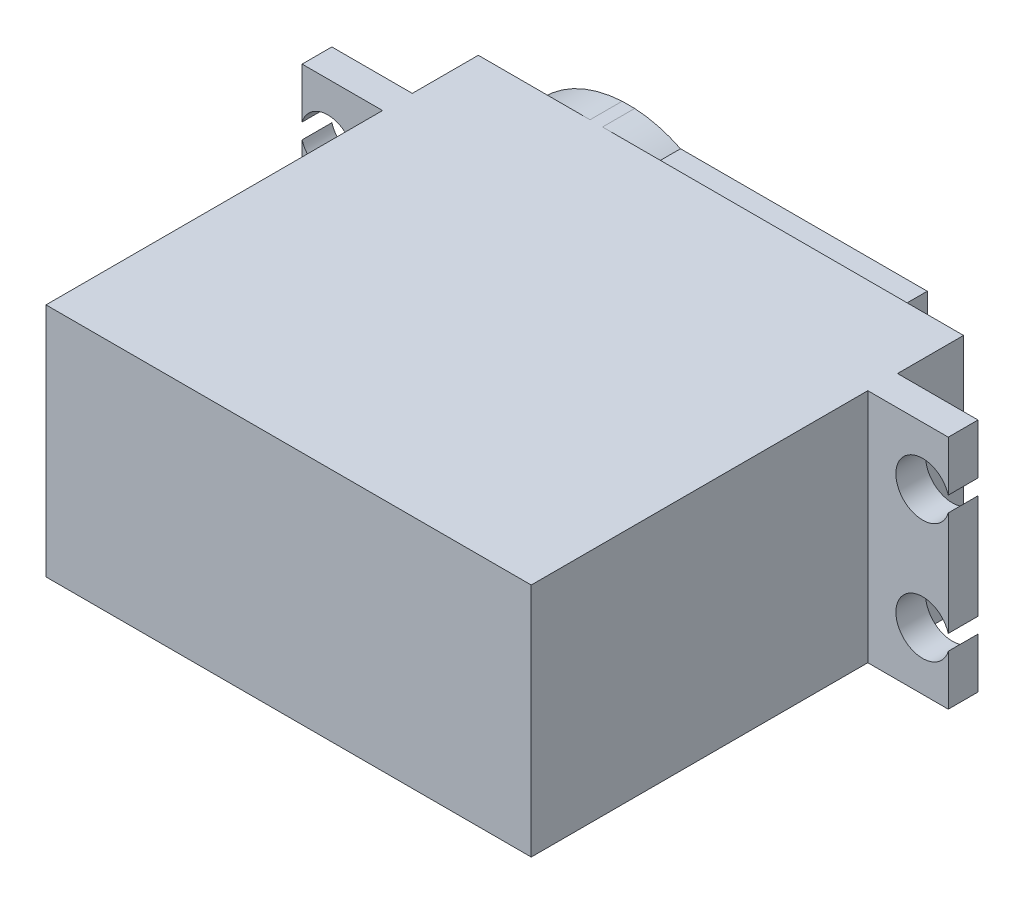
ISO-10303-21;
HEADER;
FILE_DESCRIPTION(('STEP AP214'),'2;1');
FILE_NAME('part.step','',(''),(''),'','','');
FILE_SCHEMA(('AUTOMOTIVE_DESIGN { 1 0 10303 214 1 1 1 1 }'));
ENDSEC;
DATA;
#1=APPLICATION_CONTEXT('core data for automotive mechanical design processes');
#2=APPLICATION_PROTOCOL_DEFINITION('international standard','automotive_design',2000,#1);
#3=PRODUCT_CONTEXT('',#1,'mechanical');
#4=PRODUCT('Part','Part','',(#3));
#5=PRODUCT_RELATED_PRODUCT_CATEGORY('part','',(#4));
#6=PRODUCT_DEFINITION_FORMATION('','',#4);
#7=PRODUCT_DEFINITION_CONTEXT('part definition',#1,'design');
#8=PRODUCT_DEFINITION('design','',#6,#7);
#9=PRODUCT_DEFINITION_SHAPE('','',#8);
#10=(LENGTH_UNIT() NAMED_UNIT(*) SI_UNIT(.MILLI.,.METRE.));
#11=(NAMED_UNIT(*) PLANE_ANGLE_UNIT() SI_UNIT($,.RADIAN.));
#12=(NAMED_UNIT(*) SI_UNIT($,.STERADIAN.) SOLID_ANGLE_UNIT());
#13=UNCERTAINTY_MEASURE_WITH_UNIT(LENGTH_MEASURE(1.E-05),#10,'distance_accuracy_value','');
#14=(GEOMETRIC_REPRESENTATION_CONTEXT(3) GLOBAL_UNCERTAINTY_ASSIGNED_CONTEXT((#13)) GLOBAL_UNIT_ASSIGNED_CONTEXT((#10,
#11,#12)) REPRESENTATION_CONTEXT('',''));
#15=CARTESIAN_POINT('',(0.,0.,0.));
#16=DIRECTION('',(0.,0.,1.));
#17=DIRECTION('',(1.,0.,0.));
#18=AXIS2_PLACEMENT_3D('',#15,#16,#17);
#19=CARTESIAN_POINT('',(-20.399999967,19.812,-18.174999972));
#20=DIRECTION('',(0.,0.,1.));
#21=DIRECTION('',(1.,0.,0.));
#22=AXIS2_PLACEMENT_3D('',#19,#20,#21);
#23=PLANE('',#22);
#24=CARTESIAN_POINT('',(-10.4799999729716,9.906,-18.174999972));
#25=DIRECTION('',(0.,0.,-1.));
#26=DIRECTION('',(-1.,0.,0.));
#27=AXIS2_PLACEMENT_3D('',#24,#25,#26);
#28=CIRCLE('',#27,9.9199999940284);
#29=CARTESIAN_POINT('',(-11.0068432907838,0.,-18.174999972));
#30=VERTEX_POINT('',#29);
#31=CARTESIAN_POINT('',(-20.399999967,9.906,-18.174999972));
#32=VERTEX_POINT('',#31);
#33=EDGE_CURVE('E493',#30,#32,#28,.T.);
#34=ORIENTED_EDGE('',*,*,#33,.F.);
#35=DIRECTION('',(-1.,0.,0.));
#36=VECTOR('',#35,1.);
#37=CARTESIAN_POINT('',(-20.399999967,0.,-18.174999972));
#38=LINE('',#37,#36);
#39=CARTESIAN_POINT('',(-20.399999967,0.,-18.174999972));
#40=VERTEX_POINT('',#39);
#41=EDGE_CURVE('E371',#30,#40,#38,.T.);
#42=ORIENTED_EDGE('',*,*,#41,.T.);
#43=DIRECTION('',(0.,-1.,0.));
#44=VECTOR('',#43,1.);
#45=CARTESIAN_POINT('',(-20.399999967,19.812,-18.174999972));
#46=LINE('',#45,#44);
#47=EDGE_CURVE('E455',#32,#40,#46,.T.);
#48=ORIENTED_EDGE('',*,*,#47,.F.);
#49=EDGE_LOOP('',(#34,#42,#48));
#50=FACE_BOUND('',#49,.T.);
#51=ADVANCED_FACE('F51',(#50),#23,.F.);
#52=CARTESIAN_POINT('',(-11.0068432907839,19.812,-18.174999972));
#53=VERTEX_POINT('',#52);
#54=EDGE_CURVE('E475',#32,#53,#28,.T.);
#55=ORIENTED_EDGE('',*,*,#54,.F.);
#56=CARTESIAN_POINT('',(-20.399999967,19.812,-18.174999972));
#57=VERTEX_POINT('',#56);
#58=EDGE_CURVE('E456',#57,#32,#46,.T.);
#59=ORIENTED_EDGE('',*,*,#58,.F.);
#60=DIRECTION('',(-1.,0.,0.));
#61=VECTOR('',#60,1.);
#62=CARTESIAN_POINT('',(-20.399999967,19.812,-18.174999972));
#63=LINE('',#62,#61);
#64=EDGE_CURVE('E331',#53,#57,#63,.T.);
#65=ORIENTED_EDGE('',*,*,#64,.F.);
#66=EDGE_LOOP('',(#55,#59,#65));
#67=FACE_BOUND('',#66,.T.);
#68=ADVANCED_FACE('F569',(#67),#23,.F.);
#69=CARTESIAN_POINT('',(-27.164999899,19.812,-12.624999896));
#70=DIRECTION('',(1.,0.,0.));
#71=DIRECTION('',(0.,0.,-1.));
#72=AXIS2_PLACEMENT_3D('',#69,#70,#71);
#73=PLANE('',#72);
#74=DIRECTION('',(0.,-1.,0.));
#75=VECTOR('',#74,1.);
#76=CARTESIAN_POINT('',(-27.164999899,19.812,-10.124999816));
#77=LINE('',#76,#75);
#78=CARTESIAN_POINT('',(-27.164999899,14.2951038691055,-10.124999816));
#79=VERTEX_POINT('',#78);
#80=CARTESIAN_POINT('',(-27.164999899,5.5168961308945,-10.124999816));
#81=VERTEX_POINT('',#80);
#82=EDGE_CURVE('E445',#79,#81,#77,.T.);
#83=ORIENTED_EDGE('',*,*,#82,.F.);
#84=DIRECTION('',(0.,0.,-1.));
#85=VECTOR('',#84,1.);
#86=CARTESIAN_POINT('',(-27.164999899,14.2951038691055,18.174999972));
#87=LINE('',#86,#85);
#88=CARTESIAN_POINT('',(-27.164999899,14.2951038691055,-12.624999896));
#89=VERTEX_POINT('',#88);
#90=EDGE_CURVE('E322',#79,#89,#87,.T.);
#91=ORIENTED_EDGE('',*,*,#90,.T.);
#92=DIRECTION('',(0.,-1.,0.));
#93=VECTOR('',#92,1.);
#94=CARTESIAN_POINT('',(-27.164999899,19.812,-12.624999896));
#95=LINE('',#94,#93);
#96=CARTESIAN_POINT('',(-27.164999899,5.5168961308945,-12.624999896));
#97=VERTEX_POINT('',#96);
#98=EDGE_CURVE('E451',#89,#97,#95,.T.);
#99=ORIENTED_EDGE('',*,*,#98,.T.);
#100=DIRECTION('',(0.,0.,-1.));
#101=VECTOR('',#100,1.);
#102=CARTESIAN_POINT('',(-27.164999899,5.5168961308945,18.174999972));
#103=LINE('',#102,#101);
#104=EDGE_CURVE('E310',#97,#81,#103,.F.);
#105=ORIENTED_EDGE('',*,*,#104,.T.);
#106=EDGE_LOOP('',(#83,#91,#99,#105));
#107=FACE_BOUND('',#106,.T.);
#108=ADVANCED_FACE('F576',(#107),#73,.F.);
#109=CARTESIAN_POINT('',(-27.164999899,4.2231036931055,-10.124999816));
#110=VERTEX_POINT('',#109);
#111=CARTESIAN_POINT('',(-27.164999899,0.,-10.124999816));
#112=VERTEX_POINT('',#111);
#113=EDGE_CURVE('E439',#110,#112,#77,.T.);
#114=ORIENTED_EDGE('',*,*,#113,.F.);
#115=DIRECTION('',(0.,0.,-1.));
#116=VECTOR('',#115,1.);
#117=CARTESIAN_POINT('',(-27.164999899,4.2231036931055,18.174999972));
#118=LINE('',#117,#116);
#119=CARTESIAN_POINT('',(-27.164999899,4.2231036931055,-12.624999896));
#120=VERTEX_POINT('',#119);
#121=EDGE_CURVE('E314',#110,#120,#118,.T.);
#122=ORIENTED_EDGE('',*,*,#121,.T.);
#123=CARTESIAN_POINT('',(-27.164999899,0.,-12.624999896));
#124=VERTEX_POINT('',#123);
#125=EDGE_CURVE('E444',#120,#124,#95,.T.);
#126=ORIENTED_EDGE('',*,*,#125,.T.);
#127=DIRECTION('',(0.,0.,1.));
#128=VECTOR('',#127,1.);
#129=CARTESIAN_POINT('',(-27.164999899,0.,-12.624999896));
#130=LINE('',#129,#128);
#131=EDGE_CURVE('E382',#124,#112,#130,.T.);
#132=ORIENTED_EDGE('',*,*,#131,.T.);
#133=EDGE_LOOP('',(#114,#122,#126,#132));
#134=FACE_BOUND('',#133,.T.);
#135=ADVANCED_FACE('F710',(#134),#73,.F.);
#136=CARTESIAN_POINT('',(27.164999899,19.812,-12.624999896));
#137=DIRECTION('',(-1.,0.,0.));
#138=DIRECTION('',(0.,0.,1.));
#139=AXIS2_PLACEMENT_3D('',#136,#137,#138);
#140=PLANE('',#139);
#141=DIRECTION('',(0.,-1.,0.));
#142=VECTOR('',#141,1.);
#143=CARTESIAN_POINT('',(27.164999899,19.812,-10.124999816));
#144=LINE('',#143,#142);
#145=CARTESIAN_POINT('',(27.164999899,14.2951038691055,-10.124999816));
#146=VERTEX_POINT('',#145);
#147=CARTESIAN_POINT('',(27.164999899,5.5168961308945,-10.124999816));
#148=VERTEX_POINT('',#147);
#149=EDGE_CURVE('E423',#146,#148,#144,.T.);
#150=ORIENTED_EDGE('',*,*,#149,.T.);
#151=DIRECTION('',(0.,0.,-1.));
#152=VECTOR('',#151,1.);
#153=CARTESIAN_POINT('',(27.164999899,5.5168961308945,18.174999972));
#154=LINE('',#153,#152);
#155=CARTESIAN_POINT('',(27.164999899,5.5168961308945,-12.624999896));
#156=VERTEX_POINT('',#155);
#157=EDGE_CURVE('E306',#148,#156,#154,.T.);
#158=ORIENTED_EDGE('',*,*,#157,.T.);
#159=DIRECTION('',(0.,-1.,0.));
#160=VECTOR('',#159,1.);
#161=CARTESIAN_POINT('',(27.164999899,19.812,-12.624999896));
#162=LINE('',#161,#160);
#163=CARTESIAN_POINT('',(27.164999899,14.2951038691055,-12.624999896));
#164=VERTEX_POINT('',#163);
#165=EDGE_CURVE('E417',#164,#156,#162,.T.);
#166=ORIENTED_EDGE('',*,*,#165,.F.);
#167=DIRECTION('',(0.,0.,-1.));
#168=VECTOR('',#167,1.);
#169=CARTESIAN_POINT('',(27.164999899,14.2951038691055,18.174999972));
#170=LINE('',#169,#168);
#171=EDGE_CURVE('E286',#164,#146,#170,.F.);
#172=ORIENTED_EDGE('',*,*,#171,.T.);
#173=EDGE_LOOP('',(#150,#158,#166,#172));
#174=FACE_BOUND('',#173,.T.);
#175=ADVANCED_FACE('F687',(#174),#140,.F.);
#176=CARTESIAN_POINT('',(27.164999899,19.812,-10.124999816));
#177=VERTEX_POINT('',#176);
#178=CARTESIAN_POINT('',(27.164999899,15.5888963068945,-10.124999816));
#179=VERTEX_POINT('',#178);
#180=EDGE_CURVE('E418',#177,#179,#144,.T.);
#181=ORIENTED_EDGE('',*,*,#180,.T.);
#182=DIRECTION('',(0.,0.,-1.));
#183=VECTOR('',#182,1.);
#184=CARTESIAN_POINT('',(27.164999899,15.5888963068945,18.174999972));
#185=LINE('',#184,#183);
#186=CARTESIAN_POINT('',(27.164999899,15.5888963068945,-12.624999896));
#187=VERTEX_POINT('',#186);
#188=EDGE_CURVE('E294',#179,#187,#185,.T.);
#189=ORIENTED_EDGE('',*,*,#188,.T.);
#190=CARTESIAN_POINT('',(27.164999899,19.812,-12.624999896));
#191=VERTEX_POINT('',#190);
#192=EDGE_CURVE('E412',#191,#187,#162,.T.);
#193=ORIENTED_EDGE('',*,*,#192,.F.);
#194=DIRECTION('',(0.,0.,-1.));
#195=VECTOR('',#194,1.);
#196=CARTESIAN_POINT('',(27.164999899,19.812,-12.624999896));
#197=LINE('',#196,#195);
#198=EDGE_CURVE('E361',#177,#191,#197,.T.);
#199=ORIENTED_EDGE('',*,*,#198,.F.);
#200=EDGE_LOOP('',(#181,#189,#193,#199));
#201=FACE_BOUND('',#200,.T.);
#202=ADVANCED_FACE('F587',(#201),#140,.F.);
#203=CARTESIAN_POINT('',(20.399999967,19.812,-12.624999896));
#204=DIRECTION('',(-1.,0.,0.));
#205=DIRECTION('',(0.,0.,1.));
#206=AXIS2_PLACEMENT_3D('',#203,#204,#205);
#207=PLANE('',#206);
#208=DIRECTION('',(0.,0.,-1.));
#209=VECTOR('',#208,1.);
#210=CARTESIAN_POINT('',(20.399999967,0.,-12.624999896));
#211=LINE('',#210,#209);
#212=CARTESIAN_POINT('',(20.399999967,0.,-12.624999896));
#213=VERTEX_POINT('',#212);
#214=CARTESIAN_POINT('',(20.399999967,0.,-18.174999972));
#215=VERTEX_POINT('',#214);
#216=EDGE_CURVE('E326',#213,#215,#211,.T.);
#217=ORIENTED_EDGE('',*,*,#216,.T.);
#218=DIRECTION('',(0.,-1.,0.));
#219=VECTOR('',#218,1.);
#220=CARTESIAN_POINT('',(20.399999967,19.812,-18.174999972));
#221=LINE('',#220,#219);
#222=CARTESIAN_POINT('',(20.399999967,19.812,-18.174999972));
#223=VERTEX_POINT('',#222);
#224=EDGE_CURVE('E460',#223,#215,#221,.T.);
#225=ORIENTED_EDGE('',*,*,#224,.F.);
#226=DIRECTION('',(0.,0.,-1.));
#227=VECTOR('',#226,1.);
#228=CARTESIAN_POINT('',(20.399999967,19.812,-12.624999896));
#229=LINE('',#228,#227);
#230=CARTESIAN_POINT('',(20.399999967,19.812,-12.624999896));
#231=VERTEX_POINT('',#230);
#232=EDGE_CURVE('E327',#231,#223,#229,.T.);
#233=ORIENTED_EDGE('',*,*,#232,.F.);
#234=DIRECTION('',(0.,-1.,0.));
#235=VECTOR('',#234,1.);
#236=CARTESIAN_POINT('',(20.399999967,19.812,-12.624999896));
#237=LINE('',#236,#235);
#238=EDGE_CURVE('E367',#231,#213,#237,.T.);
#239=ORIENTED_EDGE('',*,*,#238,.T.);
#240=EDGE_LOOP('',(#217,#225,#233,#239));
#241=FACE_BOUND('',#240,.T.);
#242=ADVANCED_FACE('F53',(#241),#207,.F.);
#243=CARTESIAN_POINT('',(-9.95315665515932,19.812,-18.174999972));
#244=VERTEX_POINT('',#243);
#245=CARTESIAN_POINT('',(-6.098630297,18.80599998,-18.174999972));
#246=VERTEX_POINT('',#245);
#247=EDGE_CURVE('E480',#244,#246,#28,.T.);
#248=ORIENTED_EDGE('',*,*,#247,.F.);
#249=EDGE_CURVE('E333',#223,#244,#63,.T.);
#250=ORIENTED_EDGE('',*,*,#249,.F.);
#251=ORIENTED_EDGE('',*,*,#224,.T.);
#252=CARTESIAN_POINT('',(-9.95315665515939,0.,-18.174999972));
#253=VERTEX_POINT('',#252);
#254=EDGE_CURVE('E372',#215,#253,#38,.T.);
#255=ORIENTED_EDGE('',*,*,#254,.T.);
#256=CARTESIAN_POINT('',(-6.098630297,1.00600002,-18.174999972));
#257=VERTEX_POINT('',#256);
#258=EDGE_CURVE('E481',#257,#253,#28,.T.);
#259=ORIENTED_EDGE('',*,*,#258,.F.);
#260=DIRECTION('',(-1.,0.,0.));
#261=VECTOR('',#260,1.);
#262=CARTESIAN_POINT('',(0.,1.00600002,-18.174999972));
#263=LINE('',#262,#261);
#264=CARTESIAN_POINT('',(14.650000037,1.00600002,-18.174999972));
#265=VERTEX_POINT('',#264);
#266=EDGE_CURVE('E269',#265,#257,#263,.T.);
#267=ORIENTED_EDGE('',*,*,#266,.F.);
#268=DIRECTION('',(0.,1.,0.));
#269=VECTOR('',#268,1.);
#270=CARTESIAN_POINT('',(14.650000037,0.,-18.174999972));
#271=LINE('',#270,#269);
#272=CARTESIAN_POINT('',(14.650000037,18.80599998,-18.174999972));
#273=VERTEX_POINT('',#272);
#274=EDGE_CURVE('E74',#265,#273,#271,.T.);
#275=ORIENTED_EDGE('',*,*,#274,.T.);
#276=DIRECTION('',(-1.,0.,0.));
#277=VECTOR('',#276,1.);
#278=CARTESIAN_POINT('',(0.,18.80599998,-18.174999972));
#279=LINE('',#278,#277);
#280=EDGE_CURVE('E69',#273,#246,#279,.T.);
#281=ORIENTED_EDGE('',*,*,#280,.T.);
#282=EDGE_LOOP('',(#248,#250,#251,#255,#259,#267,#275,#281));
#283=FACE_BOUND('',#282,.T.);
#284=ADVANCED_FACE('F571',(#283),#23,.F.);
#285=CARTESIAN_POINT('',(-20.399999967,19.812,-12.624999896));
#286=DIRECTION('',(1.,0.,0.));
#287=DIRECTION('',(0.,0.,-1.));
#288=AXIS2_PLACEMENT_3D('',#285,#286,#287);
#289=PLANE('',#288);
#290=DIRECTION('',(0.,0.,1.));
#291=VECTOR('',#290,1.);
#292=CARTESIAN_POINT('',(-20.399999967,0.,-12.624999896));
#293=LINE('',#292,#291);
#294=CARTESIAN_POINT('',(-20.399999967,0.,-12.624999896));
#295=VERTEX_POINT('',#294);
#296=EDGE_CURVE('E375',#40,#295,#293,.T.);
#297=ORIENTED_EDGE('',*,*,#296,.T.);
#298=DIRECTION('',(0.,-1.,0.));
#299=VECTOR('',#298,1.);
#300=CARTESIAN_POINT('',(-20.399999967,19.812,-12.624999896));
#301=LINE('',#300,#299);
#302=CARTESIAN_POINT('',(-20.399999967,19.812,-12.624999896));
#303=VERTEX_POINT('',#302);
#304=EDGE_CURVE('E450',#303,#295,#301,.T.);
#305=ORIENTED_EDGE('',*,*,#304,.F.);
#306=DIRECTION('',(0.,0.,1.));
#307=VECTOR('',#306,1.);
#308=CARTESIAN_POINT('',(-20.399999967,19.812,-12.624999896));
#309=LINE('',#308,#307);
#310=EDGE_CURVE('E337',#57,#303,#309,.T.);
#311=ORIENTED_EDGE('',*,*,#310,.F.);
#312=ORIENTED_EDGE('',*,*,#58,.T.);
#313=ORIENTED_EDGE('',*,*,#47,.T.);
#314=EDGE_LOOP('',(#297,#305,#311,#312,#313));
#315=FACE_BOUND('',#314,.T.);
#316=ADVANCED_FACE('F580',(#315),#289,.F.);
#317=CARTESIAN_POINT('',(-20.399999967,19.812,-12.624999896));
#318=DIRECTION('',(0.,0.,1.));
#319=DIRECTION('',(1.,0.,0.));
#320=AXIS2_PLACEMENT_3D('',#317,#318,#319);
#321=PLANE('',#320);
#322=ORIENTED_EDGE('',*,*,#98,.F.);
#323=CARTESIAN_POINT('',(-25.009999891,14.942000088,-12.624999896));
#324=DIRECTION('',(0.,0.,-1.));
#325=DIRECTION('',(1.,0.,0.));
#326=AXIS2_PLACEMENT_3D('',#323,#324,#325);
#327=CIRCLE('',#326,2.249999945);
#328=CARTESIAN_POINT('',(-27.164999899,15.5888963068945,-12.624999896));
#329=VERTEX_POINT('',#328);
#330=EDGE_CURVE('E275',#329,#89,#327,.T.);
#331=ORIENTED_EDGE('',*,*,#330,.F.);
#332=CARTESIAN_POINT('',(-27.164999899,19.812,-12.624999896));
#333=VERTEX_POINT('',#332);
#334=EDGE_CURVE('E446',#333,#329,#95,.T.);
#335=ORIENTED_EDGE('',*,*,#334,.F.);
#336=DIRECTION('',(-1.,0.,0.));
#337=VECTOR('',#336,1.);
#338=CARTESIAN_POINT('',(-20.399999967,19.812,-12.624999896));
#339=LINE('',#338,#337);
#340=EDGE_CURVE('E340',#303,#333,#339,.T.);
#341=ORIENTED_EDGE('',*,*,#340,.F.);
#342=ORIENTED_EDGE('',*,*,#304,.T.);
#343=DIRECTION('',(-1.,0.,0.));
#344=VECTOR('',#343,1.);
#345=CARTESIAN_POINT('',(-20.399999967,0.,-12.624999896));
#346=LINE('',#345,#344);
#347=EDGE_CURVE('E378',#295,#124,#346,.T.);
#348=ORIENTED_EDGE('',*,*,#347,.T.);
#349=ORIENTED_EDGE('',*,*,#125,.F.);
#350=CARTESIAN_POINT('',(-25.009999891,4.869999912,-12.624999896));
#351=DIRECTION('',(0.,0.,-1.));
#352=DIRECTION('',(-1.,0.,0.));
#353=AXIS2_PLACEMENT_3D('',#350,#351,#352);
#354=CIRCLE('',#353,2.249999945);
#355=EDGE_CURVE('E282',#97,#120,#354,.T.);
#356=ORIENTED_EDGE('',*,*,#355,.F.);
#357=EDGE_LOOP('',(#322,#331,#335,#341,#342,#348,#349,#356));
#358=FACE_BOUND('',#357,.T.);
#359=ADVANCED_FACE('F584',(#358),#321,.F.);
#360=ORIENTED_EDGE('',*,*,#334,.T.);
#361=DIRECTION('',(0.,0.,-1.));
#362=VECTOR('',#361,1.);
#363=CARTESIAN_POINT('',(-27.164999899,15.5888963068945,18.174999972));
#364=LINE('',#363,#362);
#365=CARTESIAN_POINT('',(-27.164999899,15.5888963068945,-10.124999816));
#366=VERTEX_POINT('',#365);
#367=EDGE_CURVE('E318',#329,#366,#364,.F.);
#368=ORIENTED_EDGE('',*,*,#367,.T.);
#369=CARTESIAN_POINT('',(-27.164999899,19.812,-10.124999816));
#370=VERTEX_POINT('',#369);
#371=EDGE_CURVE('E440',#370,#366,#77,.T.);
#372=ORIENTED_EDGE('',*,*,#371,.F.);
#373=DIRECTION('',(0.,0.,1.));
#374=VECTOR('',#373,1.);
#375=CARTESIAN_POINT('',(-27.164999899,19.812,-12.624999896));
#376=LINE('',#375,#374);
#377=EDGE_CURVE('E343',#333,#370,#376,.T.);
#378=ORIENTED_EDGE('',*,*,#377,.F.);
#379=EDGE_LOOP('',(#360,#368,#372,#378));
#380=FACE_BOUND('',#379,.T.);
#381=ADVANCED_FACE('F706',(#380),#73,.F.);
#382=CARTESIAN_POINT('',(-27.164999899,19.812,-10.124999816));
#383=DIRECTION('',(0.,0.,-1.));
#384=DIRECTION('',(-1.,0.,0.));
#385=AXIS2_PLACEMENT_3D('',#382,#383,#384);
#386=PLANE('',#385);
#387=ORIENTED_EDGE('',*,*,#371,.T.);
#388=CARTESIAN_POINT('',(-25.009999891,14.942000088,-10.124999816));
#389=DIRECTION('',(0.,0.,-1.));
#390=DIRECTION('',(-1.,0.,0.));
#391=AXIS2_PLACEMENT_3D('',#388,#389,#390);
#392=CIRCLE('',#391,2.249999945);
#393=EDGE_CURVE('E55',#366,#79,#392,.T.);
#394=ORIENTED_EDGE('',*,*,#393,.T.);
#395=ORIENTED_EDGE('',*,*,#82,.T.);
#396=CARTESIAN_POINT('',(-25.009999891,4.869999912,-10.124999816));
#397=DIRECTION('',(0.,0.,-1.));
#398=DIRECTION('',(-1.,0.,0.));
#399=AXIS2_PLACEMENT_3D('',#396,#397,#398);
#400=CIRCLE('',#399,2.249999945);
#401=EDGE_CURVE('E467',#81,#110,#400,.T.);
#402=ORIENTED_EDGE('',*,*,#401,.T.);
#403=ORIENTED_EDGE('',*,*,#113,.T.);
#404=DIRECTION('',(1.,0.,0.));
#405=VECTOR('',#404,1.);
#406=CARTESIAN_POINT('',(-27.164999899,0.,-10.124999816));
#407=LINE('',#406,#405);
#408=CARTESIAN_POINT('',(-20.399999967,0.,-10.124999816));
#409=VERTEX_POINT('',#408);
#410=EDGE_CURVE('E386',#112,#409,#407,.T.);
#411=ORIENTED_EDGE('',*,*,#410,.T.);
#412=DIRECTION('',(0.,-1.,0.));
#413=VECTOR('',#412,1.);
#414=CARTESIAN_POINT('',(-20.399999967,19.812,-10.124999816));
#415=LINE('',#414,#413);
#416=CARTESIAN_POINT('',(-20.399999967,19.812,-10.124999816));
#417=VERTEX_POINT('',#416);
#418=EDGE_CURVE('E435',#417,#409,#415,.T.);
#419=ORIENTED_EDGE('',*,*,#418,.F.);
#420=DIRECTION('',(1.,0.,0.));
#421=VECTOR('',#420,1.);
#422=CARTESIAN_POINT('',(-27.164999899,19.812,-10.124999816));
#423=LINE('',#422,#421);
#424=EDGE_CURVE('E346',#370,#417,#423,.T.);
#425=ORIENTED_EDGE('',*,*,#424,.F.);
#426=EDGE_LOOP('',(#387,#394,#395,#402,#403,#411,#419,#425));
#427=FACE_BOUND('',#426,.T.);
#428=ADVANCED_FACE('F702',(#427),#386,.F.);
#429=CARTESIAN_POINT('',(-20.399999967,19.812,18.174999972));
#430=DIRECTION('',(1.,0.,0.));
#431=DIRECTION('',(0.,0.,-1.));
#432=AXIS2_PLACEMENT_3D('',#429,#430,#431);
#433=PLANE('',#432);
#434=DIRECTION('',(0.,0.,1.));
#435=VECTOR('',#434,1.);
#436=CARTESIAN_POINT('',(-20.399999967,0.,18.174999972));
#437=LINE('',#436,#435);
#438=CARTESIAN_POINT('',(-20.399999967,0.,18.174999972));
#439=VERTEX_POINT('',#438);
#440=EDGE_CURVE('E389',#409,#439,#437,.T.);
#441=ORIENTED_EDGE('',*,*,#440,.T.);
#442=DIRECTION('',(0.,-1.,0.));
#443=VECTOR('',#442,1.);
#444=CARTESIAN_POINT('',(-20.399999967,19.812,18.174999972));
#445=LINE('',#444,#443);
#446=CARTESIAN_POINT('',(-20.399999967,19.812,18.174999972));
#447=VERTEX_POINT('',#446);
#448=EDGE_CURVE('E431',#447,#439,#445,.T.);
#449=ORIENTED_EDGE('',*,*,#448,.F.);
#450=DIRECTION('',(0.,0.,1.));
#451=VECTOR('',#450,1.);
#452=CARTESIAN_POINT('',(-20.399999967,19.812,18.174999972));
#453=LINE('',#452,#451);
#454=EDGE_CURVE('E349',#417,#447,#453,.T.);
#455=ORIENTED_EDGE('',*,*,#454,.F.);
#456=ORIENTED_EDGE('',*,*,#418,.T.);
#457=EDGE_LOOP('',(#441,#449,#455,#456));
#458=FACE_BOUND('',#457,.T.);
#459=ADVANCED_FACE('F698',(#458),#433,.F.);
#460=CARTESIAN_POINT('',(-20.399999967,19.812,18.174999972));
#461=DIRECTION('',(0.,0.,-1.));
#462=DIRECTION('',(-1.,0.,0.));
#463=AXIS2_PLACEMENT_3D('',#460,#461,#462);
#464=PLANE('',#463);
#465=DIRECTION('',(1.,0.,0.));
#466=VECTOR('',#465,1.);
#467=CARTESIAN_POINT('',(-20.399999967,0.,18.174999972));
#468=LINE('',#467,#466);
#469=CARTESIAN_POINT('',(20.399999967,0.,18.174999972));
#470=VERTEX_POINT('',#469);
#471=EDGE_CURVE('E392',#439,#470,#468,.T.);
#472=ORIENTED_EDGE('',*,*,#471,.T.);
#473=DIRECTION('',(0.,-1.,0.));
#474=VECTOR('',#473,1.);
#475=CARTESIAN_POINT('',(20.399999967,19.812,18.174999972));
#476=LINE('',#475,#474);
#477=CARTESIAN_POINT('',(20.399999967,19.812,18.174999972));
#478=VERTEX_POINT('',#477);
#479=EDGE_CURVE('E427',#478,#470,#476,.T.);
#480=ORIENTED_EDGE('',*,*,#479,.F.);
#481=DIRECTION('',(1.,0.,0.));
#482=VECTOR('',#481,1.);
#483=CARTESIAN_POINT('',(-20.399999967,19.812,18.174999972));
#484=LINE('',#483,#482);
#485=EDGE_CURVE('E352',#447,#478,#484,.T.);
#486=ORIENTED_EDGE('',*,*,#485,.F.);
#487=ORIENTED_EDGE('',*,*,#448,.T.);
#488=EDGE_LOOP('',(#472,#480,#486,#487));
#489=FACE_BOUND('',#488,.T.);
#490=ADVANCED_FACE('F694',(#489),#464,.F.);
#491=CARTESIAN_POINT('',(20.399999967,19.812,18.174999972));
#492=DIRECTION('',(-1.,0.,0.));
#493=DIRECTION('',(0.,0.,1.));
#494=AXIS2_PLACEMENT_3D('',#491,#492,#493);
#495=PLANE('',#494);
#496=DIRECTION('',(0.,0.,-1.));
#497=VECTOR('',#496,1.);
#498=CARTESIAN_POINT('',(20.399999967,0.,18.174999972));
#499=LINE('',#498,#497);
#500=CARTESIAN_POINT('',(20.399999967,0.,-10.124999816));
#501=VERTEX_POINT('',#500);
#502=EDGE_CURVE('E395',#470,#501,#499,.T.);
#503=ORIENTED_EDGE('',*,*,#502,.T.);
#504=DIRECTION('',(0.,-1.,0.));
#505=VECTOR('',#504,1.);
#506=CARTESIAN_POINT('',(20.399999967,19.812,-10.124999816));
#507=LINE('',#506,#505);
#508=CARTESIAN_POINT('',(20.399999967,19.812,-10.124999816));
#509=VERTEX_POINT('',#508);
#510=EDGE_CURVE('E422',#509,#501,#507,.T.);
#511=ORIENTED_EDGE('',*,*,#510,.F.);
#512=DIRECTION('',(0.,0.,-1.));
#513=VECTOR('',#512,1.);
#514=CARTESIAN_POINT('',(20.399999967,19.812,18.174999972));
#515=LINE('',#514,#513);
#516=EDGE_CURVE('E355',#478,#509,#515,.T.);
#517=ORIENTED_EDGE('',*,*,#516,.F.);
#518=ORIENTED_EDGE('',*,*,#479,.T.);
#519=EDGE_LOOP('',(#503,#511,#517,#518));
#520=FACE_BOUND('',#519,.T.);
#521=ADVANCED_FACE('F690',(#520),#495,.F.);
#522=CARTESIAN_POINT('',(27.164999899,19.812,-10.124999816));
#523=DIRECTION('',(0.,0.,-1.));
#524=DIRECTION('',(-1.,0.,0.));
#525=AXIS2_PLACEMENT_3D('',#522,#523,#524);
#526=PLANE('',#525);
#527=CARTESIAN_POINT('',(27.164999899,4.2231036931055,-10.124999816));
#528=VERTEX_POINT('',#527);
#529=CARTESIAN_POINT('',(27.164999899,0.,-10.124999816));
#530=VERTEX_POINT('',#529);
#531=EDGE_CURVE('E416',#528,#530,#144,.T.);
#532=ORIENTED_EDGE('',*,*,#531,.F.);
#533=CARTESIAN_POINT('',(25.009999891,4.869999912,-10.124999816));
#534=DIRECTION('',(0.,0.,-1.));
#535=DIRECTION('',(-1.,0.,0.));
#536=AXIS2_PLACEMENT_3D('',#533,#534,#535);
#537=CIRCLE('',#536,2.249999945);
#538=EDGE_CURVE('E302',#528,#148,#537,.T.);
#539=ORIENTED_EDGE('',*,*,#538,.T.);
#540=ORIENTED_EDGE('',*,*,#149,.F.);
#541=CARTESIAN_POINT('',(25.009999891,14.942000088,-10.124999816));
#542=DIRECTION('',(0.,0.,-1.));
#543=DIRECTION('',(-1.,0.,0.));
#544=AXIS2_PLACEMENT_3D('',#541,#542,#543);
#545=CIRCLE('',#544,2.249999945);
#546=EDGE_CURVE('E290',#146,#179,#545,.T.);
#547=ORIENTED_EDGE('',*,*,#546,.T.);
#548=ORIENTED_EDGE('',*,*,#180,.F.);
#549=DIRECTION('',(1.,0.,0.));
#550=VECTOR('',#549,1.);
#551=CARTESIAN_POINT('',(27.164999899,19.812,-10.124999816));
#552=LINE('',#551,#550);
#553=EDGE_CURVE('E358',#509,#177,#552,.T.);
#554=ORIENTED_EDGE('',*,*,#553,.F.);
#555=ORIENTED_EDGE('',*,*,#510,.T.);
#556=DIRECTION('',(1.,0.,0.));
#557=VECTOR('',#556,1.);
#558=CARTESIAN_POINT('',(27.164999899,0.,-10.124999816));
#559=LINE('',#558,#557);
#560=EDGE_CURVE('E398',#501,#530,#559,.T.);
#561=ORIENTED_EDGE('',*,*,#560,.T.);
#562=EDGE_LOOP('',(#532,#539,#540,#547,#548,#554,#555,#561));
#563=FACE_BOUND('',#562,.T.);
#564=ADVANCED_FACE('F685',(#563),#526,.F.);
#565=CARTESIAN_POINT('',(27.164999899,4.2231036931055,-12.624999896));
#566=VERTEX_POINT('',#565);
#567=CARTESIAN_POINT('',(27.164999899,0.,-12.624999896));
#568=VERTEX_POINT('',#567);
#569=EDGE_CURVE('E411',#566,#568,#162,.T.);
#570=ORIENTED_EDGE('',*,*,#569,.F.);
#571=DIRECTION('',(0.,0.,-1.));
#572=VECTOR('',#571,1.);
#573=CARTESIAN_POINT('',(27.164999899,4.2231036931055,18.174999972));
#574=LINE('',#573,#572);
#575=EDGE_CURVE('E298',#566,#528,#574,.F.);
#576=ORIENTED_EDGE('',*,*,#575,.T.);
#577=ORIENTED_EDGE('',*,*,#531,.T.);
#578=DIRECTION('',(0.,0.,-1.));
#579=VECTOR('',#578,1.);
#580=CARTESIAN_POINT('',(27.164999899,0.,-12.624999896));
#581=LINE('',#580,#579);
#582=EDGE_CURVE('E402',#530,#568,#581,.T.);
#583=ORIENTED_EDGE('',*,*,#582,.T.);
#584=EDGE_LOOP('',(#570,#576,#577,#583));
#585=FACE_BOUND('',#584,.T.);
#586=ADVANCED_FACE('F681',(#585),#140,.F.);
#587=CARTESIAN_POINT('',(20.399999967,19.812,-12.624999896));
#588=DIRECTION('',(0.,0.,1.));
#589=DIRECTION('',(1.,0.,0.));
#590=AXIS2_PLACEMENT_3D('',#587,#588,#589);
#591=PLANE('',#590);
#592=ORIENTED_EDGE('',*,*,#165,.T.);
#593=CARTESIAN_POINT('',(25.009999891,4.869999912,-12.624999896));
#594=DIRECTION('',(0.,0.,-1.));
#595=DIRECTION('',(1.,0.,0.));
#596=AXIS2_PLACEMENT_3D('',#593,#594,#595);
#597=CIRCLE('',#596,2.249999945);
#598=EDGE_CURVE('E271',#566,#156,#597,.T.);
#599=ORIENTED_EDGE('',*,*,#598,.F.);
#600=ORIENTED_EDGE('',*,*,#569,.T.);
#601=DIRECTION('',(-1.,0.,0.));
#602=VECTOR('',#601,1.);
#603=CARTESIAN_POINT('',(20.399999967,0.,-12.624999896));
#604=LINE('',#603,#602);
#605=EDGE_CURVE('E332',#568,#213,#604,.T.);
#606=ORIENTED_EDGE('',*,*,#605,.T.);
#607=ORIENTED_EDGE('',*,*,#238,.F.);
#608=DIRECTION('',(-1.,0.,0.));
#609=VECTOR('',#608,1.);
#610=CARTESIAN_POINT('',(20.399999967,19.812,-12.624999896));
#611=LINE('',#610,#609);
#612=EDGE_CURVE('E364',#191,#231,#611,.T.);
#613=ORIENTED_EDGE('',*,*,#612,.F.);
#614=ORIENTED_EDGE('',*,*,#192,.T.);
#615=CARTESIAN_POINT('',(25.009999891,14.942000088,-12.624999896));
#616=DIRECTION('',(0.,0.,1.));
#617=DIRECTION('',(1.,0.,0.));
#618=AXIS2_PLACEMENT_3D('',#615,#616,#617);
#619=CIRCLE('',#618,2.249999945);
#620=EDGE_CURVE('E464',#187,#164,#619,.T.);
#621=ORIENTED_EDGE('',*,*,#620,.T.);
#622=EDGE_LOOP('',(#592,#599,#600,#606,#607,#613,#614,#621));
#623=FACE_BOUND('',#622,.T.);
#624=ADVANCED_FACE('F676',(#623),#591,.F.);
#625=CARTESIAN_POINT('',(0.,19.812,0.));
#626=DIRECTION('',(0.,-1.,0.));
#627=DIRECTION('',(0.,0.,-1.));
#628=AXIS2_PLACEMENT_3D('',#625,#626,#627);
#629=PLANE('',#628);
#630=ORIENTED_EDGE('',*,*,#232,.T.);
#631=ORIENTED_EDGE('',*,*,#249,.T.);
#632=DIRECTION('',(0.,0.,1.));
#633=VECTOR('',#632,1.);
#634=CARTESIAN_POINT('',(-9.95315665515932,19.812,-20.874999906));
#635=LINE('',#634,#633);
#636=CARTESIAN_POINT('',(-9.95315665515932,19.812,-20.874999906));
#637=VERTEX_POINT('',#636);
#638=EDGE_CURVE('E596',#637,#244,#635,.T.);
#639=ORIENTED_EDGE('',*,*,#638,.F.);
#640=DIRECTION('',(1.,0.,0.));
#641=VECTOR('',#640,1.);
#642=CARTESIAN_POINT('',(0.,19.812,-20.874999906));
#643=LINE('',#642,#641);
#644=CARTESIAN_POINT('',(-11.0068432907839,19.812,-20.874999906));
#645=VERTEX_POINT('',#644);
#646=EDGE_CURVE('E510',#645,#637,#643,.T.);
#647=ORIENTED_EDGE('',*,*,#646,.F.);
#648=DIRECTION('',(0.,0.,1.));
#649=VECTOR('',#648,1.);
#650=CARTESIAN_POINT('',(-11.0068432907839,19.812,-20.874999906));
#651=LINE('',#650,#649);
#652=EDGE_CURVE('E602',#645,#53,#651,.T.);
#653=ORIENTED_EDGE('',*,*,#652,.T.);
#654=ORIENTED_EDGE('',*,*,#64,.T.);
#655=ORIENTED_EDGE('',*,*,#310,.T.);
#656=ORIENTED_EDGE('',*,*,#340,.T.);
#657=ORIENTED_EDGE('',*,*,#377,.T.);
#658=ORIENTED_EDGE('',*,*,#424,.T.);
#659=ORIENTED_EDGE('',*,*,#454,.T.);
#660=ORIENTED_EDGE('',*,*,#485,.T.);
#661=ORIENTED_EDGE('',*,*,#516,.T.);
#662=ORIENTED_EDGE('',*,*,#553,.T.);
#663=ORIENTED_EDGE('',*,*,#198,.T.);
#664=ORIENTED_EDGE('',*,*,#612,.T.);
#665=EDGE_LOOP('',(#630,#631,#639,#647,#653,#654,#655,#656,#657,#658,#659,#660,#661,#662,#663,#664));
#666=FACE_BOUND('',#665,.T.);
#667=ADVANCED_FACE('F594',(#666),#629,.F.);
#668=CARTESIAN_POINT('',(0.,0.,0.));
#669=DIRECTION('',(0.,-1.,0.));
#670=DIRECTION('',(0.,0.,-1.));
#671=AXIS2_PLACEMENT_3D('',#668,#669,#670);
#672=PLANE('',#671);
#673=ORIENTED_EDGE('',*,*,#216,.F.);
#674=ORIENTED_EDGE('',*,*,#605,.F.);
#675=ORIENTED_EDGE('',*,*,#582,.F.);
#676=ORIENTED_EDGE('',*,*,#560,.F.);
#677=ORIENTED_EDGE('',*,*,#502,.F.);
#678=ORIENTED_EDGE('',*,*,#471,.F.);
#679=ORIENTED_EDGE('',*,*,#440,.F.);
#680=ORIENTED_EDGE('',*,*,#410,.F.);
#681=ORIENTED_EDGE('',*,*,#131,.F.);
#682=ORIENTED_EDGE('',*,*,#347,.F.);
#683=ORIENTED_EDGE('',*,*,#296,.F.);
#684=ORIENTED_EDGE('',*,*,#41,.F.);
#685=DIRECTION('',(0.,0.,1.));
#686=VECTOR('',#685,1.);
#687=CARTESIAN_POINT('',(-11.0068432907838,0.,-20.874999906));
#688=LINE('',#687,#686);
#689=CARTESIAN_POINT('',(-11.0068432907838,0.,-20.874999906));
#690=VERTEX_POINT('',#689);
#691=EDGE_CURVE('E277',#690,#30,#688,.T.);
#692=ORIENTED_EDGE('',*,*,#691,.F.);
#693=DIRECTION('',(-1.,0.,0.));
#694=VECTOR('',#693,1.);
#695=CARTESIAN_POINT('',(0.,0.,-20.874999906));
#696=LINE('',#695,#694);
#697=CARTESIAN_POINT('',(-9.95315665515939,0.,-20.874999906));
#698=VERTEX_POINT('',#697);
#699=EDGE_CURVE('E253',#698,#690,#696,.T.);
#700=ORIENTED_EDGE('',*,*,#699,.F.);
#701=DIRECTION('',(0.,0.,1.));
#702=VECTOR('',#701,1.);
#703=CARTESIAN_POINT('',(-9.95315665515939,0.,-20.874999906));
#704=LINE('',#703,#702);
#705=EDGE_CURVE('E249',#698,#253,#704,.T.);
#706=ORIENTED_EDGE('',*,*,#705,.T.);
#707=ORIENTED_EDGE('',*,*,#254,.F.);
#708=EDGE_LOOP('',(#673,#674,#675,#676,#677,#678,#679,#680,#681,#682,#683,#684,#692,#700,#706,#707));
#709=FACE_BOUND('',#708,.T.);
#710=ADVANCED_FACE('F619',(#709),#672,.T.);
#711=CARTESIAN_POINT('',(25.009999891,14.942000088,18.174999972));
#712=DIRECTION('',(0.,0.,-1.));
#713=DIRECTION('',(-1.,0.,0.));
#714=AXIS2_PLACEMENT_3D('',#711,#712,#713);
#715=CYLINDRICAL_SURFACE('',#714,2.249999945);
#716=ORIENTED_EDGE('',*,*,#546,.F.);
#717=ORIENTED_EDGE('',*,*,#171,.F.);
#718=ORIENTED_EDGE('',*,*,#620,.F.);
#719=ORIENTED_EDGE('',*,*,#188,.F.);
#720=EDGE_LOOP('',(#716,#717,#718,#719));
#721=FACE_BOUND('',#720,.T.);
#722=ADVANCED_FACE('F660',(#721),#715,.F.);
#723=CARTESIAN_POINT('',(25.009999891,4.869999912,18.174999972));
#724=DIRECTION('',(0.,0.,-1.));
#725=DIRECTION('',(-1.,0.,0.));
#726=AXIS2_PLACEMENT_3D('',#723,#724,#725);
#727=CYLINDRICAL_SURFACE('',#726,2.249999945);
#728=ORIENTED_EDGE('',*,*,#538,.F.);
#729=ORIENTED_EDGE('',*,*,#575,.F.);
#730=ORIENTED_EDGE('',*,*,#598,.T.);
#731=ORIENTED_EDGE('',*,*,#157,.F.);
#732=EDGE_LOOP('',(#728,#729,#730,#731));
#733=FACE_BOUND('',#732,.T.);
#734=ADVANCED_FACE('F663',(#733),#727,.F.);
#735=CARTESIAN_POINT('',(-25.009999891,4.869999912,18.174999972));
#736=DIRECTION('',(0.,0.,-1.));
#737=DIRECTION('',(-1.,0.,0.));
#738=AXIS2_PLACEMENT_3D('',#735,#736,#737);
#739=CYLINDRICAL_SURFACE('',#738,2.249999945);
#740=ORIENTED_EDGE('',*,*,#401,.F.);
#741=ORIENTED_EDGE('',*,*,#104,.F.);
#742=ORIENTED_EDGE('',*,*,#355,.T.);
#743=ORIENTED_EDGE('',*,*,#121,.F.);
#744=EDGE_LOOP('',(#740,#741,#742,#743));
#745=FACE_BOUND('',#744,.T.);
#746=ADVANCED_FACE('F666',(#745),#739,.F.);
#747=CARTESIAN_POINT('',(-25.009999891,14.942000088,18.174999972));
#748=DIRECTION('',(0.,0.,-1.));
#749=DIRECTION('',(-1.,0.,0.));
#750=AXIS2_PLACEMENT_3D('',#747,#748,#749);
#751=CYLINDRICAL_SURFACE('',#750,2.249999945);
#752=ORIENTED_EDGE('',*,*,#393,.F.);
#753=ORIENTED_EDGE('',*,*,#367,.F.);
#754=ORIENTED_EDGE('',*,*,#330,.T.);
#755=ORIENTED_EDGE('',*,*,#90,.F.);
#756=EDGE_LOOP('',(#752,#753,#754,#755));
#757=FACE_BOUND('',#756,.T.);
#758=ADVANCED_FACE('F659',(#757),#751,.F.);
#759=CARTESIAN_POINT('',(0.,1.00600002,-20.874999906));
#760=DIRECTION('',(0.,1.,0.));
#761=DIRECTION('',(0.,0.,1.));
#762=AXIS2_PLACEMENT_3D('',#759,#760,#761);
#763=PLANE('',#762);
#764=ORIENTED_EDGE('',*,*,#266,.T.);
#765=DIRECTION('',(0.,0.,1.));
#766=VECTOR('',#765,1.);
#767=CARTESIAN_POINT('',(-6.098630297,1.00600002,-20.874999906));
#768=LINE('',#767,#766);
#769=CARTESIAN_POINT('',(-6.098630297,1.00600002,-20.874999906));
#770=VERTEX_POINT('',#769);
#771=EDGE_CURVE('E246',#770,#257,#768,.T.);
#772=ORIENTED_EDGE('',*,*,#771,.F.);
#773=DIRECTION('',(-1.,0.,0.));
#774=VECTOR('',#773,1.);
#775=CARTESIAN_POINT('',(0.,1.00600002,-20.874999906));
#776=LINE('',#775,#774);
#777=CARTESIAN_POINT('',(14.650000037,1.00600002,-20.874999906));
#778=VERTEX_POINT('',#777);
#779=EDGE_CURVE('E254',#778,#770,#776,.T.);
#780=ORIENTED_EDGE('',*,*,#779,.F.);
#781=DIRECTION('',(0.,0.,1.));
#782=VECTOR('',#781,1.);
#783=CARTESIAN_POINT('',(14.650000037,1.00600002,-20.874999906));
#784=LINE('',#783,#782);
#785=EDGE_CURVE('E505',#778,#265,#784,.T.);
#786=ORIENTED_EDGE('',*,*,#785,.T.);
#787=EDGE_LOOP('',(#764,#772,#780,#786));
#788=FACE_BOUND('',#787,.T.);
#789=ADVANCED_FACE('F268',(#788),#763,.F.);
#790=CARTESIAN_POINT('',(-10.4799999729716,9.906,-20.874999906));
#791=DIRECTION('',(0.,0.,1.));
#792=DIRECTION('',(1.,0.,0.));
#793=AXIS2_PLACEMENT_3D('',#790,#791,#792);
#794=CYLINDRICAL_SURFACE('',#793,9.9199999940284);
#795=ORIENTED_EDGE('',*,*,#258,.T.);
#796=ORIENTED_EDGE('',*,*,#705,.F.);
#797=CARTESIAN_POINT('',(-10.4799999729716,9.906,-20.874999906));
#798=DIRECTION('',(0.,0.,-1.));
#799=DIRECTION('',(-1.,0.,0.));
#800=AXIS2_PLACEMENT_3D('',#797,#798,#799);
#801=CIRCLE('',#800,9.9199999940284);
#802=EDGE_CURVE('E241',#770,#698,#801,.T.);
#803=ORIENTED_EDGE('',*,*,#802,.F.);
#804=ORIENTED_EDGE('',*,*,#771,.T.);
#805=EDGE_LOOP('',(#795,#796,#803,#804));
#806=FACE_BOUND('',#805,.T.);
#807=ADVANCED_FACE('F244',(#806),#794,.T.);
#808=ORIENTED_EDGE('',*,*,#33,.T.);
#809=ORIENTED_EDGE('',*,*,#54,.T.);
#810=ORIENTED_EDGE('',*,*,#652,.F.);
#811=EDGE_CURVE('E257',#690,#645,#801,.T.);
#812=ORIENTED_EDGE('',*,*,#811,.F.);
#813=ORIENTED_EDGE('',*,*,#691,.T.);
#814=EDGE_LOOP('',(#808,#809,#810,#812,#813));
#815=FACE_BOUND('',#814,.T.);
#816=ADVANCED_FACE('F615',(#815),#794,.T.);
#817=ORIENTED_EDGE('',*,*,#247,.T.);
#818=DIRECTION('',(0.,0.,1.));
#819=VECTOR('',#818,1.);
#820=CARTESIAN_POINT('',(-6.098630297,18.80599998,-20.874999906));
#821=LINE('',#820,#819);
#822=CARTESIAN_POINT('',(-6.098630297,18.80599998,-20.874999906));
#823=VERTEX_POINT('',#822);
#824=EDGE_CURVE('E603',#823,#246,#821,.T.);
#825=ORIENTED_EDGE('',*,*,#824,.F.);
#826=EDGE_CURVE('E256',#637,#823,#801,.T.);
#827=ORIENTED_EDGE('',*,*,#826,.F.);
#828=ORIENTED_EDGE('',*,*,#638,.T.);
#829=EDGE_LOOP('',(#817,#825,#827,#828));
#830=FACE_BOUND('',#829,.T.);
#831=ADVANCED_FACE('F600',(#830),#794,.T.);
#832=CARTESIAN_POINT('',(0.,18.80599998,-20.874999906));
#833=DIRECTION('',(0.,1.,0.));
#834=DIRECTION('',(-1.,0.,0.));
#835=AXIS2_PLACEMENT_3D('',#832,#833,#834);
#836=PLANE('',#835);
#837=ORIENTED_EDGE('',*,*,#280,.F.);
#838=DIRECTION('',(0.,0.,1.));
#839=VECTOR('',#838,1.);
#840=CARTESIAN_POINT('',(14.650000037,18.80599998,-20.874999906));
#841=LINE('',#840,#839);
#842=CARTESIAN_POINT('',(14.650000037,18.80599998,-20.874999906));
#843=VERTEX_POINT('',#842);
#844=EDGE_CURVE('E608',#843,#273,#841,.T.);
#845=ORIENTED_EDGE('',*,*,#844,.F.);
#846=DIRECTION('',(-1.,0.,0.));
#847=VECTOR('',#846,1.);
#848=CARTESIAN_POINT('',(0.,18.80599998,-20.874999906));
#849=LINE('',#848,#847);
#850=EDGE_CURVE('E506',#843,#823,#849,.T.);
#851=ORIENTED_EDGE('',*,*,#850,.T.);
#852=ORIENTED_EDGE('',*,*,#824,.T.);
#853=EDGE_LOOP('',(#837,#845,#851,#852));
#854=FACE_BOUND('',#853,.T.);
#855=ADVANCED_FACE('F565',(#854),#836,.T.);
#856=CARTESIAN_POINT('',(14.650000037,0.,-20.874999906));
#857=DIRECTION('',(1.,0.,0.));
#858=DIRECTION('',(0.,0.,-1.));
#859=AXIS2_PLACEMENT_3D('',#856,#857,#858);
#860=PLANE('',#859);
#861=ORIENTED_EDGE('',*,*,#274,.F.);
#862=ORIENTED_EDGE('',*,*,#785,.F.);
#863=DIRECTION('',(0.,1.,0.));
#864=VECTOR('',#863,1.);
#865=CARTESIAN_POINT('',(14.650000037,0.,-20.874999906));
#866=LINE('',#865,#864);
#867=EDGE_CURVE('E263',#778,#843,#866,.T.);
#868=ORIENTED_EDGE('',*,*,#867,.T.);
#869=ORIENTED_EDGE('',*,*,#844,.T.);
#870=EDGE_LOOP('',(#861,#862,#868,#869));
#871=FACE_BOUND('',#870,.T.);
#872=ADVANCED_FACE('F560',(#871),#860,.T.);
#873=CARTESIAN_POINT('',(0.,0.,-20.874999906));
#874=DIRECTION('',(0.,0.,-1.));
#875=DIRECTION('',(-1.,0.,0.));
#876=AXIS2_PLACEMENT_3D('',#873,#874,#875);
#877=PLANE('',#876);
#878=CARTESIAN_POINT('',(-10.4799999729716,9.906,-20.874999906));
#879=DIRECTION('',(0.,0.,-1.));
#880=DIRECTION('',(-1.,0.,0.));
#881=AXIS2_PLACEMENT_3D('',#878,#879,#880);
#882=CIRCLE('',#881,6.549999981);
#883=CARTESIAN_POINT('',(-17.0299999539716,9.906,-20.874999906));
#884=VERTEX_POINT('',#883);
#885=EDGE_CURVE('E500',#884,#884,#882,.T.);
#886=ORIENTED_EDGE('',*,*,#885,.F.);
#887=EDGE_LOOP('',(#886));
#888=FACE_BOUND('',#887,.T.);
#889=ORIENTED_EDGE('',*,*,#779,.T.);
#890=ORIENTED_EDGE('',*,*,#802,.T.);
#891=ORIENTED_EDGE('',*,*,#699,.T.);
#892=ORIENTED_EDGE('',*,*,#811,.T.);
#893=ORIENTED_EDGE('',*,*,#646,.T.);
#894=ORIENTED_EDGE('',*,*,#826,.T.);
#895=ORIENTED_EDGE('',*,*,#850,.F.);
#896=ORIENTED_EDGE('',*,*,#867,.F.);
#897=EDGE_LOOP('',(#889,#890,#891,#892,#893,#894,#895,#896));
#898=FACE_BOUND('',#897,.T.);
#899=ADVANCED_FACE('F260',(#888,#898),#877,.T.);
#900=CARTESIAN_POINT('',(-10.4799999729716,9.906,-22.034999872));
#901=DIRECTION('',(0.,0.,1.));
#902=DIRECTION('',(1.,0.,0.));
#903=AXIS2_PLACEMENT_3D('',#900,#901,#902);
#904=CYLINDRICAL_SURFACE('',#903,6.549999981);
#905=CARTESIAN_POINT('',(-10.4799999729716,9.906,-22.034999872));
#906=DIRECTION('',(0.,0.,-1.));
#907=DIRECTION('',(-1.,0.,0.));
#908=AXIS2_PLACEMENT_3D('',#905,#906,#907);
#909=CIRCLE('',#908,6.549999981);
#910=CARTESIAN_POINT('',(-17.0299999539716,9.906,-22.034999872));
#911=VERTEX_POINT('',#910);
#912=EDGE_CURVE('E497',#911,#911,#909,.T.);
#913=ORIENTED_EDGE('',*,*,#912,.F.);
#914=EDGE_LOOP('',(#913));
#915=FACE_BOUND('',#914,.T.);
#916=ORIENTED_EDGE('',*,*,#885,.T.);
#917=EDGE_LOOP('',(#916));
#918=FACE_BOUND('',#917,.T.);
#919=ADVANCED_FACE('F550',(#915,#918),#904,.T.);
#920=CARTESIAN_POINT('',(-10.4799999729716,9.906,-22.034999872));
#921=DIRECTION('',(0.,0.,-1.));
#922=DIRECTION('',(-1.,0.,0.));
#923=AXIS2_PLACEMENT_3D('',#920,#921,#922);
#924=PLANE('',#923);
#925=CARTESIAN_POINT('',(-10.4799999729716,9.906,-22.034999872));
#926=DIRECTION('',(0.,0.,-1.));
#927=DIRECTION('',(-1.,0.,0.));
#928=AXIS2_PLACEMENT_3D('',#925,#926,#927);
#929=CIRCLE('',#928,5.334999998);
#930=CARTESIAN_POINT('',(-5.14499997497159,9.906,-22.034999872));
#931=VERTEX_POINT('',#930);
#932=EDGE_CURVE('E61',#931,#931,#929,.T.);
#933=ORIENTED_EDGE('',*,*,#932,.F.);
#934=EDGE_LOOP('',(#933));
#935=FACE_BOUND('',#934,.T.);
#936=ORIENTED_EDGE('',*,*,#912,.T.);
#937=EDGE_LOOP('',(#936));
#938=FACE_BOUND('',#937,.T.);
#939=ADVANCED_FACE('F544',(#935,#938),#924,.T.);
#940=CARTESIAN_POINT('',(-10.4799999729716,9.906,-22.694999822));
#941=DIRECTION('',(0.,0.,1.));
#942=DIRECTION('',(1.,0.,0.));
#943=AXIS2_PLACEMENT_3D('',#940,#941,#942);
#944=CYLINDRICAL_SURFACE('',#943,5.334999998);
#945=CARTESIAN_POINT('',(-10.4799999729716,9.906,-22.694999822));
#946=DIRECTION('',(0.,0.,-1.));
#947=DIRECTION('',(-1.,0.,0.));
#948=AXIS2_PLACEMENT_3D('',#945,#946,#947);
#949=CIRCLE('',#948,5.334999998);
#950=CARTESIAN_POINT('',(-5.14499997497159,9.906,-22.694999822));
#951=VERTEX_POINT('',#950);
#952=EDGE_CURVE('E517',#951,#951,#949,.T.);
#953=CARTESIAN_POINT('',(-5.14499997497159,9.906,-22.694999822));
#954=CARTESIAN_POINT('',(-5.14499997497159,9.906,-22.6881248225208));
#955=CARTESIAN_POINT('',(-5.14499997497159,9.906,-22.6812498230417));
#956=CARTESIAN_POINT('',(-5.14499997497159,9.906,-22.6674998240833));
#957=CARTESIAN_POINT('',(-5.14499997497159,9.906,-22.6606248246042));
#958=CARTESIAN_POINT('',(-5.14499997497159,9.906,-22.6468748256458));
#959=CARTESIAN_POINT('',(-5.14499997497159,9.906,-22.6399998261667));
#960=CARTESIAN_POINT('',(-5.14499997497159,9.906,-22.6262498272083));
#961=CARTESIAN_POINT('',(-5.14499997497159,9.906,-22.6193748277292));
#962=CARTESIAN_POINT('',(-5.14499997497159,9.906,-22.6056248287708));
#963=CARTESIAN_POINT('',(-5.14499997497159,9.906,-22.5987498292917));
#964=CARTESIAN_POINT('',(-5.14499997497159,9.906,-22.5849998303333));
#965=CARTESIAN_POINT('',(-5.14499997497159,9.906,-22.5781248308542));
#966=CARTESIAN_POINT('',(-5.14499997497159,9.906,-22.5643748318958));
#967=CARTESIAN_POINT('',(-5.14499997497159,9.906,-22.5574998324167));
#968=CARTESIAN_POINT('',(-5.14499997497159,9.906,-22.5437498334583));
#969=CARTESIAN_POINT('',(-5.14499997497159,9.906,-22.5368748339792));
#970=CARTESIAN_POINT('',(-5.14499997497159,9.906,-22.5231248350208));
#971=CARTESIAN_POINT('',(-5.14499997497159,9.906,-22.5162498355417));
#972=CARTESIAN_POINT('',(-5.14499997497159,9.906,-22.5024998365833));
#973=CARTESIAN_POINT('',(-5.14499997497159,9.906,-22.4956248371042));
#974=CARTESIAN_POINT('',(-5.14499997497159,9.906,-22.4818748381458));
#975=CARTESIAN_POINT('',(-5.14499997497159,9.906,-22.4749998386667));
#976=CARTESIAN_POINT('',(-5.14499997497159,9.906,-22.4612498397083));
#977=CARTESIAN_POINT('',(-5.14499997497159,9.906,-22.4543748402292));
#978=CARTESIAN_POINT('',(-5.14499997497159,9.906,-22.4406248412708));
#979=CARTESIAN_POINT('',(-5.14499997497159,9.906,-22.4337498417917));
#980=CARTESIAN_POINT('',(-5.14499997497159,9.906,-22.4199998428333));
#981=CARTESIAN_POINT('',(-5.14499997497159,9.906,-22.4131248433542));
#982=CARTESIAN_POINT('',(-5.14499997497159,9.906,-22.3993748443958));
#983=CARTESIAN_POINT('',(-5.14499997497159,9.906,-22.3924998449167));
#984=CARTESIAN_POINT('',(-5.14499997497159,9.906,-22.3787498459583));
#985=CARTESIAN_POINT('',(-5.14499997497159,9.906,-22.3718748464792));
#986=CARTESIAN_POINT('',(-5.14499997497159,9.906,-22.3581248475208));
#987=CARTESIAN_POINT('',(-5.14499997497159,9.906,-22.3512498480417));
#988=CARTESIAN_POINT('',(-5.14499997497159,9.906,-22.3374998490833));
#989=CARTESIAN_POINT('',(-5.14499997497159,9.906,-22.3306248496042));
#990=CARTESIAN_POINT('',(-5.14499997497159,9.906,-22.3168748506458));
#991=CARTESIAN_POINT('',(-5.14499997497159,9.906,-22.3099998511667));
#992=CARTESIAN_POINT('',(-5.14499997497159,9.906,-22.2962498522083));
#993=CARTESIAN_POINT('',(-5.14499997497159,9.906,-22.2893748527292));
#994=CARTESIAN_POINT('',(-5.14499997497159,9.906,-22.2756248537708));
#995=CARTESIAN_POINT('',(-5.14499997497159,9.906,-22.2687498542917));
#996=CARTESIAN_POINT('',(-5.14499997497159,9.906,-22.2549998553333));
#997=CARTESIAN_POINT('',(-5.14499997497159,9.906,-22.2481248558542));
#998=CARTESIAN_POINT('',(-5.14499997497159,9.906,-22.2343748568958));
#999=CARTESIAN_POINT('',(-5.14499997497159,9.906,-22.2274998574167));
#1000=CARTESIAN_POINT('',(-5.14499997497159,9.906,-22.2137498584583));
#1001=CARTESIAN_POINT('',(-5.14499997497159,9.906,-22.2068748589792));
#1002=CARTESIAN_POINT('',(-5.14499997497159,9.906,-22.1931248600208));
#1003=CARTESIAN_POINT('',(-5.14499997497159,9.906,-22.1862498605417));
#1004=CARTESIAN_POINT('',(-5.14499997497159,9.906,-22.1724998615833));
#1005=CARTESIAN_POINT('',(-5.14499997497159,9.906,-22.1656248621042));
#1006=CARTESIAN_POINT('',(-5.14499997497159,9.906,-22.1518748631458));
#1007=CARTESIAN_POINT('',(-5.14499997497159,9.906,-22.1449998636667));
#1008=CARTESIAN_POINT('',(-5.14499997497159,9.906,-22.1312498647083));
#1009=CARTESIAN_POINT('',(-5.14499997497159,9.906,-22.1243748652292));
#1010=CARTESIAN_POINT('',(-5.14499997497159,9.906,-22.1106248662708));
#1011=CARTESIAN_POINT('',(-5.14499997497159,9.906,-22.1037498667917));
#1012=CARTESIAN_POINT('',(-5.14499997497159,9.906,-22.0899998678333));
#1013=CARTESIAN_POINT('',(-5.14499997497159,9.906,-22.0831248683542));
#1014=CARTESIAN_POINT('',(-5.14499997497159,9.906,-22.0693748693958));
#1015=CARTESIAN_POINT('',(-5.14499997497159,9.906,-22.0624998699167));
#1016=CARTESIAN_POINT('',(-5.14499997497159,9.906,-22.0487498709583));
#1017=CARTESIAN_POINT('',(-5.14499997497159,9.906,-22.0418748714792));
#1018=CARTESIAN_POINT('',(-5.14499997497159,9.906,-22.034999872));
#1019=B_SPLINE_CURVE_WITH_KNOTS('',3,(#953,#954,#955,#956,#957,#958,#959,#960,#961,#962,#963,
#964,#965,#966,#967,#968,#969,#970,#971,#972,#973,#974,#975,#976,#977,#978,#979,#980,#981,#982,
#983,#984,#985,#986,#987,#988,#989,#990,#991,#992,#993,#994,#995,#996,#997,#998,#999,#1000,
#1001,#1002,#1003,#1004,#1005,#1006,#1007,#1008,#1009,#1010,#1011,#1012,#1013,#1014,#1015,#1016,
#1017,#1018),.UNSPECIFIED.,.F.,.F.,(4,2,2,2,2,2,2,2,2,2,2,2,2,2,2,2,2,2,2,2,2,2,2,2,2,2,2,2,2,2,
2,2,4),(0.,0.0206249984374997,0.0412499968749994,0.061874995312499,0.0824999937499987,
0.103124992187498,0.123749990624998,0.144374989062498,0.164999987499997,0.185624985937497,
0.206249984374997,0.2268749828125,0.24749998125,0.268124979687499,0.288749978124999,
0.309374976562499,0.329999974999998,0.350624973437498,0.371249971874998,0.391874970312497,
0.412499968749997,0.433124967187497,0.453749965625,0.4743749640625,0.494999962499999,
0.515624960937499,0.536249959374999,0.556874957812498,0.577499956249998,0.598124954687498,
0.618749953124997,0.639374951562497,0.65999995),.UNSPECIFIED.);
#1020=EDGE_CURVE('BSEAM538',#951,#931,#1019,.T.);
#1021=ORIENTED_EDGE('',*,*,#952,.F.);
#1022=ORIENTED_EDGE('',*,*,#932,.T.);
#1023=ORIENTED_EDGE('',*,*,#1020,.T.);
#1024=ORIENTED_EDGE('',*,*,#1020,.F.);
#1025=EDGE_LOOP('',(#1021,#1023,#1022,#1024));
#1026=FACE_BOUND('',#1025,.T.);
#1027=ADVANCED_FACE('F538',(#1026),#944,.T.);
#1028=CARTESIAN_POINT('',(-10.4799999729716,9.906,-22.694999822));
#1029=DIRECTION('',(0.,0.,-1.));
#1030=DIRECTION('',(-1.,0.,0.));
#1031=AXIS2_PLACEMENT_3D('',#1028,#1029,#1030);
#1032=PLANE('',#1031);
#1033=CARTESIAN_POINT('',(-10.4799999729716,9.906,-22.694999822));
#1034=DIRECTION('',(0.,0.,-1.));
#1035=DIRECTION('',(-1.,0.,0.));
#1036=AXIS2_PLACEMENT_3D('',#1033,#1034,#1035);
#1037=CIRCLE('',#1036,2.975000019);
#1038=CARTESIAN_POINT('',(-13.4549999919716,9.906,-22.694999822));
#1039=VERTEX_POINT('',#1038);
#1040=EDGE_CURVE('E11',#1039,#1039,#1037,.T.);
#1041=ORIENTED_EDGE('',*,*,#1040,.F.);
#1042=EDGE_LOOP('',(#1041));
#1043=FACE_BOUND('',#1042,.T.);
#1044=ORIENTED_EDGE('',*,*,#952,.T.);
#1045=EDGE_LOOP('',(#1044));
#1046=FACE_BOUND('',#1045,.T.);
#1047=ADVANCED_FACE('F532',(#1043,#1046),#1032,.T.);
#1048=CARTESIAN_POINT('',(-10.4799999729716,9.906,-26.69499995));
#1049=DIRECTION('',(0.,0.,1.));
#1050=DIRECTION('',(1.,0.,0.));
#1051=AXIS2_PLACEMENT_3D('',#1048,#1049,#1050);
#1052=CYLINDRICAL_SURFACE('',#1051,2.975000019);
#1053=CARTESIAN_POINT('',(-10.4799999729716,9.906,-26.69499995));
#1054=DIRECTION('',(0.,0.,-1.));
#1055=DIRECTION('',(-1.,0.,0.));
#1056=AXIS2_PLACEMENT_3D('',#1053,#1054,#1055);
#1057=CIRCLE('',#1056,2.975000019);
#1058=CARTESIAN_POINT('',(-13.4549999919716,9.906,-26.69499995));
#1059=VERTEX_POINT('',#1058);
#1060=EDGE_CURVE('E521',#1059,#1059,#1057,.T.);
#1061=ORIENTED_EDGE('',*,*,#1060,.F.);
#1062=EDGE_LOOP('',(#1061));
#1063=FACE_BOUND('',#1062,.T.);
#1064=ORIENTED_EDGE('',*,*,#1040,.T.);
#1065=EDGE_LOOP('',(#1064));
#1066=FACE_BOUND('',#1065,.T.);
#1067=ADVANCED_FACE('F529',(#1063,#1066),#1052,.T.);
#1068=CARTESIAN_POINT('',(-10.4799999729716,9.906,-26.69499995));
#1069=DIRECTION('',(0.,0.,-1.));
#1070=DIRECTION('',(-1.,0.,0.));
#1071=AXIS2_PLACEMENT_3D('',#1068,#1069,#1070);
#1072=PLANE('',#1071);
#1073=ORIENTED_EDGE('',*,*,#1060,.T.);
#1074=EDGE_LOOP('',(#1073));
#1075=FACE_BOUND('',#1074,.T.);
#1076=ADVANCED_FACE('F527',(#1075),#1072,.T.);
#1077=CLOSED_SHELL('',(#51,#68,#108,#135,#175,#202,#242,#284,#316,#359,#381,#428,#459,#490,#521,
#564,#586,#624,#667,#710,#722,#734,#746,#758,#789,#807,#816,#831,#855,#872,#899,#919,#939,#1027,
#1047,#1067,#1076));
#1078=MANIFOLD_SOLID_BREP('B2',#1077);
#1079=ADVANCED_BREP_SHAPE_REPRESENTATION('',(#18,#1078),#14);
#1080=SHAPE_DEFINITION_REPRESENTATION(#9,#1079);
ENDSEC;
END-ISO-10303-21;
